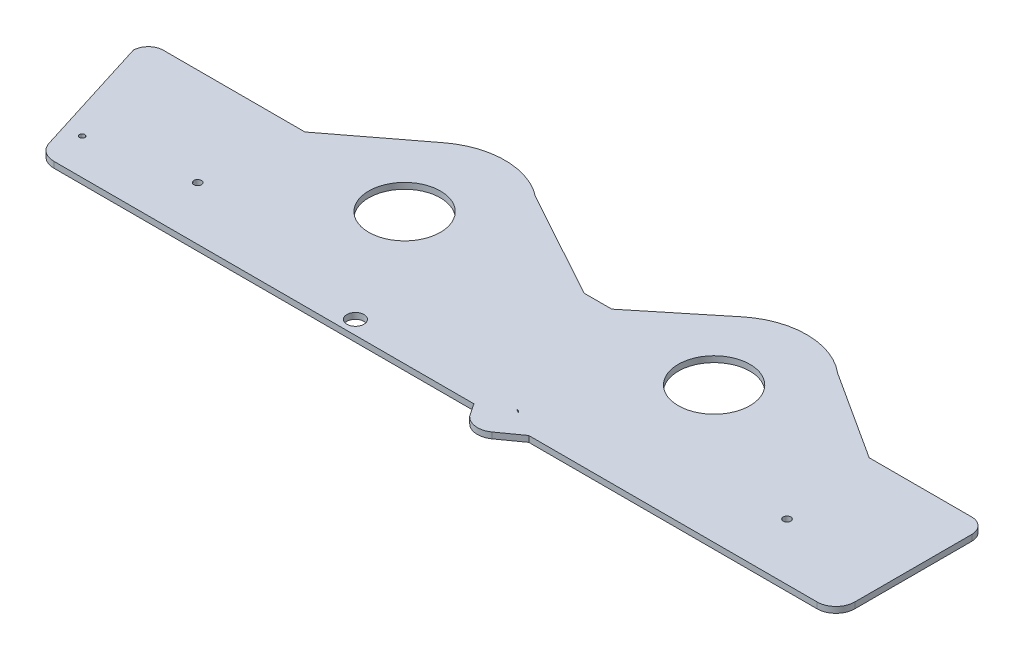
ISO-10303-21;
HEADER;
FILE_DESCRIPTION(('STEP AP214'),'2;1');
FILE_NAME('part.step','',(''),(''),'','','');
FILE_SCHEMA(('AUTOMOTIVE_DESIGN { 1 0 10303 214 1 1 1 1 }'));
ENDSEC;
DATA;
#1=APPLICATION_CONTEXT('core data for automotive mechanical design processes');
#2=APPLICATION_PROTOCOL_DEFINITION('international standard','automotive_design',2000,#1);
#3=PRODUCT_CONTEXT('',#1,'mechanical');
#4=PRODUCT('Part','Part','',(#3));
#5=PRODUCT_RELATED_PRODUCT_CATEGORY('part','',(#4));
#6=PRODUCT_DEFINITION_FORMATION('','',#4);
#7=PRODUCT_DEFINITION_CONTEXT('part definition',#1,'design');
#8=PRODUCT_DEFINITION('design','',#6,#7);
#9=PRODUCT_DEFINITION_SHAPE('','',#8);
#10=(LENGTH_UNIT() NAMED_UNIT(*) SI_UNIT(.MILLI.,.METRE.));
#11=(NAMED_UNIT(*) PLANE_ANGLE_UNIT() SI_UNIT($,.RADIAN.));
#12=(NAMED_UNIT(*) SI_UNIT($,.STERADIAN.) SOLID_ANGLE_UNIT());
#13=UNCERTAINTY_MEASURE_WITH_UNIT(LENGTH_MEASURE(1.E-05),#10,'distance_accuracy_value','');
#14=(GEOMETRIC_REPRESENTATION_CONTEXT(3) GLOBAL_UNCERTAINTY_ASSIGNED_CONTEXT((#13)) GLOBAL_UNIT_ASSIGNED_CONTEXT((#10,
#11,#12)) REPRESENTATION_CONTEXT('',''));
#15=CARTESIAN_POINT('',(0.,0.,0.));
#16=DIRECTION('',(0.,0.,1.));
#17=DIRECTION('',(1.,0.,0.));
#18=AXIS2_PLACEMENT_3D('',#15,#16,#17);
#19=CARTESIAN_POINT('',(264.5,0.,-70.));
#20=DIRECTION('',(0.,1.,0.));
#21=DIRECTION('',(0.,0.,1.));
#22=AXIS2_PLACEMENT_3D('',#19,#20,#21);
#23=CYLINDRICAL_SURFACE('',#22,10.);
#24=DIRECTION('',(0.,1.,0.));
#25=VECTOR('',#24,1.);
#26=CARTESIAN_POINT('',(270.323640372309,0.,-61.8707188009016));
#27=LINE('',#26,#25);
#28=CARTESIAN_POINT('',(270.323640372309,0.,-61.8707188009016));
#29=VERTEX_POINT('',#28);
#30=CARTESIAN_POINT('',(270.323640372309,3.175,-61.8707188009016));
#31=VERTEX_POINT('',#30);
#32=EDGE_CURVE('E215',#29,#31,#27,.T.);
#33=ORIENTED_EDGE('',*,*,#32,.T.);
#34=CARTESIAN_POINT('',(264.5,3.175,-70.));
#35=DIRECTION('',(0.,1.,0.));
#36=DIRECTION('',(0.,0.,1.));
#37=AXIS2_PLACEMENT_3D('',#34,#35,#36);
#38=CIRCLE('',#37,10.);
#39=CARTESIAN_POINT('',(257.164027826321,3.175,-63.204154779058));
#40=VERTEX_POINT('',#39);
#41=EDGE_CURVE('E58',#31,#40,#38,.F.);
#42=ORIENTED_EDGE('',*,*,#41,.T.);
#43=DIRECTION('',(0.,1.,0.));
#44=VECTOR('',#43,1.);
#45=CARTESIAN_POINT('',(257.164027826321,0.,-63.204154779058));
#46=LINE('',#45,#44);
#47=CARTESIAN_POINT('',(257.164027826321,0.,-63.204154779058));
#48=VERTEX_POINT('',#47);
#49=EDGE_CURVE('E230',#48,#40,#46,.T.);
#50=ORIENTED_EDGE('',*,*,#49,.F.);
#51=CARTESIAN_POINT('',(264.5,0.,-70.));
#52=DIRECTION('',(0.,1.,0.));
#53=DIRECTION('',(0.,0.,1.));
#54=AXIS2_PLACEMENT_3D('',#51,#52,#53);
#55=CIRCLE('',#54,10.);
#56=EDGE_CURVE('E564',#48,#29,#55,.T.);
#57=ORIENTED_EDGE('',*,*,#56,.T.);
#58=EDGE_LOOP('',(#33,#42,#50,#57));
#59=FACE_BOUND('',#58,.T.);
#60=ADVANCED_FACE('F43',(#59),#23,.T.);
#61=CARTESIAN_POINT('',(206.258119686764,0.,-138.832894737649));
#62=DIRECTION('',(-0.82957784665794,0.,0.558391078308362));
#63=DIRECTION('',(0.558391078308362,0.,0.82957784665794));
#64=AXIS2_PLACEMENT_3D('',#61,#62,#63);
#65=PLANE('',#64);
#66=ORIENTED_EDGE('',*,*,#49,.T.);
#67=DIRECTION('',(-0.558391078308362,0.,-0.82957784665794));
#68=VECTOR('',#67,1.);
#69=CARTESIAN_POINT('',(206.258119686764,3.175,-138.832894737649));
#70=LINE('',#69,#68);
#71=CARTESIAN_POINT('',(252.589726142366,3.175,-70.));
#72=VERTEX_POINT('',#71);
#73=EDGE_CURVE('E473',#40,#72,#70,.T.);
#74=ORIENTED_EDGE('',*,*,#73,.T.);
#75=DIRECTION('',(0.,1.,0.));
#76=VECTOR('',#75,1.);
#77=CARTESIAN_POINT('',(252.589726142366,0.,-70.));
#78=LINE('',#77,#76);
#79=CARTESIAN_POINT('',(252.589726142366,0.,-70.));
#80=VERTEX_POINT('',#79);
#81=EDGE_CURVE('E546',#80,#72,#78,.T.);
#82=ORIENTED_EDGE('',*,*,#81,.F.);
#83=DIRECTION('',(0.558391078308362,0.,0.82957784665794));
#84=VECTOR('',#83,1.);
#85=CARTESIAN_POINT('',(206.258119686764,0.,-138.832894737649));
#86=LINE('',#85,#84);
#87=EDGE_CURVE('E221',#80,#48,#86,.T.);
#88=ORIENTED_EDGE('',*,*,#87,.T.);
#89=EDGE_LOOP('',(#66,#74,#82,#88));
#90=FACE_BOUND('',#89,.T.);
#91=ADVANCED_FACE('F451',(#90),#65,.T.);
#92=CARTESIAN_POINT('',(101.776463936064,0.,-174.764335414678));
#93=DIRECTION('',(-0.503245940608634,0.,0.864143230755718));
#94=DIRECTION('',(0.864143230755718,0.,0.503245940608634));
#95=AXIS2_PLACEMENT_3D('',#92,#93,#94);
#96=PLANE('',#95);
#97=DIRECTION('',(-0.864143230755718,0.,-0.503245940608634));
#98=VECTOR('',#97,1.);
#99=CARTESIAN_POINT('',(101.776463936064,3.175,-174.764335414678));
#100=LINE('',#99,#98);
#101=CARTESIAN_POINT('',(268.849345076715,3.175,-77.4670978418141));
#102=VERTEX_POINT('',#101);
#103=CARTESIAN_POINT('',(266.045546336288,3.175,-79.0999293958723));
#104=VERTEX_POINT('',#103);
#105=EDGE_CURVE('E468',#102,#104,#100,.T.);
#106=ORIENTED_EDGE('',*,*,#105,.F.);
#107=DIRECTION('',(0.,1.,0.));
#108=VECTOR('',#107,1.);
#109=CARTESIAN_POINT('',(268.849345076715,0.,-77.4670978418142));
#110=LINE('',#109,#108);
#111=CARTESIAN_POINT('',(268.849345076715,0.,-77.4670978418141));
#112=VERTEX_POINT('',#111);
#113=EDGE_CURVE('E214',#112,#102,#110,.T.);
#114=ORIENTED_EDGE('',*,*,#113,.F.);
#115=DIRECTION('',(0.864143230755718,0.,0.503245940608634));
#116=VECTOR('',#115,1.);
#117=CARTESIAN_POINT('',(101.776463936064,0.,-174.764335414678));
#118=LINE('',#117,#116);
#119=CARTESIAN_POINT('',(266.045546336288,0.,-79.0999293958722));
#120=VERTEX_POINT('',#119);
#121=EDGE_CURVE('E566',#120,#112,#118,.T.);
#122=ORIENTED_EDGE('',*,*,#121,.F.);
#123=DIRECTION('',(0.,1.,0.));
#124=VECTOR('',#123,1.);
#125=CARTESIAN_POINT('',(266.045546336288,0.,-79.0999293958723));
#126=LINE('',#125,#124);
#127=EDGE_CURVE('E66',#120,#104,#126,.T.);
#128=ORIENTED_EDGE('',*,*,#127,.T.);
#129=EDGE_LOOP('',(#106,#114,#122,#128));
#130=FACE_BOUND('',#129,.T.);
#131=ADVANCED_FACE('F456',(#130),#96,.F.);
#132=CARTESIAN_POINT('',(62.3888453469937,0.,87.0892491789818));
#133=DIRECTION('',(-0.582364037230876,0.,-0.812928119909844));
#134=DIRECTION('',(-0.812928119909844,0.,0.582364037230876));
#135=AXIS2_PLACEMENT_3D('',#132,#133,#134);
#136=PLANE('',#135);
#137=DIRECTION('',(0.812928119909844,0.,-0.582364037230876));
#138=VECTOR('',#137,1.);
#139=CARTESIAN_POINT('',(62.3888453469937,3.175,87.0892491789818));
#140=LINE('',#139,#138);
#141=CARTESIAN_POINT('',(281.671389990958,3.175,-70.));
#142=VERTEX_POINT('',#141);
#143=EDGE_CURVE('E11',#31,#142,#140,.T.);
#144=ORIENTED_EDGE('',*,*,#143,.F.);
#145=ORIENTED_EDGE('',*,*,#32,.F.);
#146=DIRECTION('',(-0.812928119909844,0.,0.582364037230877));
#147=VECTOR('',#146,1.);
#148=CARTESIAN_POINT('',(62.3888453469937,0.,87.0892491789818));
#149=LINE('',#148,#147);
#150=CARTESIAN_POINT('',(281.671389990958,0.,-70.));
#151=VERTEX_POINT('',#150);
#152=EDGE_CURVE('E212',#151,#29,#149,.T.);
#153=ORIENTED_EDGE('',*,*,#152,.F.);
#154=DIRECTION('',(0.,1.,0.));
#155=VECTOR('',#154,1.);
#156=CARTESIAN_POINT('',(281.671389990958,0.,-70.));
#157=LINE('',#156,#155);
#158=EDGE_CURVE('E203',#151,#142,#157,.T.);
#159=ORIENTED_EDGE('',*,*,#158,.T.);
#160=EDGE_LOOP('',(#144,#145,#153,#159));
#161=FACE_BOUND('',#160,.T.);
#162=ADVANCED_FACE('F211',(#161),#136,.F.);
#163=CARTESIAN_POINT('',(265.281257273604,3.175,-74.5638669813256));
#164=DIRECTION('',(0.,-1.,0.));
#165=DIRECTION('',(0.,0.,-1.));
#166=AXIS2_PLACEMENT_3D('',#163,#164,#165);
#167=CYLINDRICAL_SURFACE('',#166,4.60000000000001);
#168=CARTESIAN_POINT('',(265.281257273604,3.175,-74.5638669813256));
#169=DIRECTION('',(0.,1.,0.));
#170=DIRECTION('',(0.,0.,1.));
#171=AXIS2_PLACEMENT_3D('',#168,#169,#170);
#172=CIRCLE('',#171,4.60000000000001);
#173=EDGE_CURVE('E341',#102,#104,#172,.T.);
#174=ORIENTED_EDGE('',*,*,#173,.T.);
#175=ORIENTED_EDGE('',*,*,#127,.F.);
#176=CARTESIAN_POINT('',(265.281257273604,0.,-74.5638669813256));
#177=DIRECTION('',(0.,1.,0.));
#178=DIRECTION('',(0.,0.,1.));
#179=AXIS2_PLACEMENT_3D('',#176,#177,#178);
#180=CIRCLE('',#179,4.60000000000001);
#181=EDGE_CURVE('E309',#112,#120,#180,.T.);
#182=ORIENTED_EDGE('',*,*,#181,.F.);
#183=ORIENTED_EDGE('',*,*,#113,.T.);
#184=EDGE_LOOP('',(#174,#175,#182,#183));
#185=FACE_BOUND('',#184,.T.);
#186=ADVANCED_FACE('F462',(#185),#167,.F.);
#187=CARTESIAN_POINT('',(0.,0.,-70.));
#188=DIRECTION('',(0.,0.,1.));
#189=DIRECTION('',(1.,0.,0.));
#190=AXIS2_PLACEMENT_3D('',#187,#188,#189);
#191=PLANE('',#190);
#192=DIRECTION('',(1.,0.,0.));
#193=VECTOR('',#192,1.);
#194=CARTESIAN_POINT('',(0.,3.175,-70.));
#195=LINE('',#194,#193);
#196=CARTESIAN_POINT('',(434.5,3.175,-70.));
#197=VERTEX_POINT('',#196);
#198=EDGE_CURVE('E193',#142,#197,#195,.T.);
#199=ORIENTED_EDGE('',*,*,#198,.F.);
#200=ORIENTED_EDGE('',*,*,#158,.F.);
#201=DIRECTION('',(1.,0.,0.));
#202=VECTOR('',#201,1.);
#203=CARTESIAN_POINT('',(0.,0.,-70.));
#204=LINE('',#203,#202);
#205=CARTESIAN_POINT('',(434.5,0.,-70.));
#206=VERTEX_POINT('',#205);
#207=EDGE_CURVE('E397',#151,#206,#204,.T.);
#208=ORIENTED_EDGE('',*,*,#207,.T.);
#209=DIRECTION('',(0.,1.,0.));
#210=VECTOR('',#209,1.);
#211=CARTESIAN_POINT('',(434.5,3.175,-70.));
#212=LINE('',#211,#210);
#213=EDGE_CURVE('E206',#206,#197,#212,.T.);
#214=ORIENTED_EDGE('',*,*,#213,.T.);
#215=EDGE_LOOP('',(#199,#200,#208,#214));
#216=FACE_BOUND('',#215,.T.);
#217=ADVANCED_FACE('F202',(#216),#191,.T.);
#218=CARTESIAN_POINT('',(0.,3.175,-150.));
#219=DIRECTION('',(0.,0.,-1.));
#220=DIRECTION('',(-1.,0.,0.));
#221=AXIS2_PLACEMENT_3D('',#218,#219,#220);
#222=PLANE('',#221);
#223=DIRECTION('',(1.,0.,0.));
#224=VECTOR('',#223,1.);
#225=CARTESIAN_POINT('',(0.,0.,-150.));
#226=LINE('',#225,#224);
#227=CARTESIAN_POINT('',(382.106475607173,0.,-150.));
#228=VERTEX_POINT('',#227);
#229=CARTESIAN_POINT('',(436.5,0.,-150.));
#230=VERTEX_POINT('',#229);
#231=EDGE_CURVE('E350',#228,#230,#226,.T.);
#232=ORIENTED_EDGE('',*,*,#231,.F.);
#233=DIRECTION('',(0.,-1.,0.));
#234=VECTOR('',#233,1.);
#235=CARTESIAN_POINT('',(382.106475607173,3.175,-150.));
#236=LINE('',#235,#234);
#237=CARTESIAN_POINT('',(382.106475607173,3.175,-150.));
#238=VERTEX_POINT('',#237);
#239=EDGE_CURVE('E240',#238,#228,#236,.T.);
#240=ORIENTED_EDGE('',*,*,#239,.F.);
#241=DIRECTION('',(1.,0.,0.));
#242=VECTOR('',#241,1.);
#243=CARTESIAN_POINT('',(0.,3.175,-150.));
#244=LINE('',#243,#242);
#245=CARTESIAN_POINT('',(436.5,3.175,-150.));
#246=VERTEX_POINT('',#245);
#247=EDGE_CURVE('E310',#238,#246,#244,.T.);
#248=ORIENTED_EDGE('',*,*,#247,.T.);
#249=DIRECTION('',(0.,-1.,0.));
#250=VECTOR('',#249,1.);
#251=CARTESIAN_POINT('',(436.5,3.175,-150.));
#252=LINE('',#251,#250);
#253=EDGE_CURVE('E344',#246,#230,#252,.T.);
#254=ORIENTED_EDGE('',*,*,#253,.T.);
#255=EDGE_LOOP('',(#232,#240,#248,#254));
#256=FACE_BOUND('',#255,.T.);
#257=ADVANCED_FACE('F514',(#256),#222,.T.);
#258=CARTESIAN_POINT('',(309.,3.175,-150.));
#259=DIRECTION('',(0.,-1.,0.));
#260=DIRECTION('',(0.,0.,-1.));
#261=AXIS2_PLACEMENT_3D('',#258,#259,#260);
#262=CYLINDRICAL_SURFACE('',#261,40.);
#263=DIRECTION('',(0.,-1.,0.));
#264=VECTOR('',#263,1.);
#265=CARTESIAN_POINT('',(283.734164599155,3.175,-181.010281544955));
#266=LINE('',#265,#264);
#267=CARTESIAN_POINT('',(283.734164599155,3.175,-181.010281544955));
#268=VERTEX_POINT('',#267);
#269=CARTESIAN_POINT('',(283.734164599155,0.,-181.010281544955));
#270=VERTEX_POINT('',#269);
#271=EDGE_CURVE('E264',#268,#270,#266,.T.);
#272=ORIENTED_EDGE('',*,*,#271,.F.);
#273=CARTESIAN_POINT('',(309.,3.175,-150.));
#274=DIRECTION('',(0.,1.,0.));
#275=DIRECTION('',(0.,0.,1.));
#276=AXIS2_PLACEMENT_3D('',#273,#274,#275);
#277=CIRCLE('',#276,40.);
#278=CARTESIAN_POINT('',(334.871034878903,3.175,-180.507204957101));
#279=VERTEX_POINT('',#278);
#280=EDGE_CURVE('E249',#279,#268,#277,.T.);
#281=ORIENTED_EDGE('',*,*,#280,.F.);
#282=DIRECTION('',(0.,-1.,0.));
#283=VECTOR('',#282,1.);
#284=CARTESIAN_POINT('',(334.871034878903,3.175,-180.507204957101));
#285=LINE('',#284,#283);
#286=CARTESIAN_POINT('',(334.871034878903,0.,-180.507204957101));
#287=VERTEX_POINT('',#286);
#288=EDGE_CURVE('E52',#287,#279,#285,.F.);
#289=ORIENTED_EDGE('',*,*,#288,.F.);
#290=CARTESIAN_POINT('',(309.,0.,-150.));
#291=DIRECTION('',(0.,1.,0.));
#292=DIRECTION('',(0.,0.,1.));
#293=AXIS2_PLACEMENT_3D('',#290,#291,#292);
#294=CIRCLE('',#293,40.);
#295=EDGE_CURVE('E248',#287,#270,#294,.T.);
#296=ORIENTED_EDGE('',*,*,#295,.T.);
#297=EDGE_LOOP('',(#272,#281,#289,#296));
#298=FACE_BOUND('',#297,.T.);
#299=ADVANCED_FACE('F512',(#298),#262,.T.);
#300=CARTESIAN_POINT('',(231.01461959859,3.175,-150.));
#301=VERTEX_POINT('',#300);
#302=CARTESIAN_POINT('',(245.673378314399,3.175,-150.));
#303=VERTEX_POINT('',#302);
#304=EDGE_CURVE('E308',#301,#303,#244,.T.);
#305=ORIENTED_EDGE('',*,*,#304,.T.);
#306=DIRECTION('',(0.,-1.,0.));
#307=VECTOR('',#306,1.);
#308=CARTESIAN_POINT('',(245.673378314399,3.175,-150.));
#309=LINE('',#308,#307);
#310=CARTESIAN_POINT('',(245.673378314399,0.,-150.));
#311=VERTEX_POINT('',#310);
#312=EDGE_CURVE('E256',#303,#311,#309,.T.);
#313=ORIENTED_EDGE('',*,*,#312,.T.);
#314=CARTESIAN_POINT('',(231.01461959859,0.,-150.));
#315=VERTEX_POINT('',#314);
#316=EDGE_CURVE('E349',#315,#311,#226,.T.);
#317=ORIENTED_EDGE('',*,*,#316,.F.);
#318=DIRECTION('',(0.,1.,0.));
#319=VECTOR('',#318,1.);
#320=CARTESIAN_POINT('',(231.01461959859,3.175,-150.));
#321=LINE('',#320,#319);
#322=EDGE_CURVE('E292',#315,#301,#321,.T.);
#323=ORIENTED_EDGE('',*,*,#322,.T.);
#324=EDGE_LOOP('',(#305,#313,#317,#323));
#325=FACE_BOUND('',#324,.T.);
#326=ADVANCED_FACE('F508',(#325),#222,.T.);
#327=CARTESIAN_POINT('',(8.,3.175,-150.));
#328=VERTEX_POINT('',#327);
#329=CARTESIAN_POINT('',(83.029725003325,3.175,-150.));
#330=VERTEX_POINT('',#329);
#331=EDGE_CURVE('E315',#328,#330,#244,.T.);
#332=ORIENTED_EDGE('',*,*,#331,.T.);
#333=DIRECTION('',(0.,-1.,0.));
#334=VECTOR('',#333,1.);
#335=CARTESIAN_POINT('',(83.0297250033249,3.175,-150.));
#336=LINE('',#335,#334);
#337=CARTESIAN_POINT('',(83.029725003325,0.,-150.));
#338=VERTEX_POINT('',#337);
#339=EDGE_CURVE('E295',#330,#338,#336,.T.);
#340=ORIENTED_EDGE('',*,*,#339,.T.);
#341=CARTESIAN_POINT('',(8.,0.,-150.));
#342=VERTEX_POINT('',#341);
#343=EDGE_CURVE('E355',#342,#338,#226,.T.);
#344=ORIENTED_EDGE('',*,*,#343,.F.);
#345=DIRECTION('',(0.,-1.,0.));
#346=VECTOR('',#345,1.);
#347=CARTESIAN_POINT('',(8.,3.175,-150.));
#348=LINE('',#347,#346);
#349=EDGE_CURVE('E394',#328,#342,#348,.T.);
#350=ORIENTED_EDGE('',*,*,#349,.F.);
#351=EDGE_LOOP('',(#332,#340,#344,#350));
#352=FACE_BOUND('',#351,.T.);
#353=ADVANCED_FACE('F511',(#352),#222,.T.);
#354=CARTESIAN_POINT('',(149.,3.175,-150.040398610273));
#355=DIRECTION('',(0.,-1.,0.));
#356=DIRECTION('',(0.,0.,-1.));
#357=AXIS2_PLACEMENT_3D('',#354,#355,#356);
#358=CYLINDRICAL_SURFACE('',#357,40.);
#359=DIRECTION('',(0.,-1.,0.));
#360=VECTOR('',#359,1.);
#361=CARTESIAN_POINT('',(124.164543782823,3.175,-181.39642059146));
#362=LINE('',#361,#360);
#363=CARTESIAN_POINT('',(124.164543782823,3.175,-181.39642059146));
#364=VERTEX_POINT('',#363);
#365=CARTESIAN_POINT('',(124.164543782823,0.,-181.39642059146));
#366=VERTEX_POINT('',#365);
#367=EDGE_CURVE('E288',#364,#366,#362,.T.);
#368=ORIENTED_EDGE('',*,*,#367,.F.);
#369=CARTESIAN_POINT('',(149.,3.175,-150.040398610273));
#370=DIRECTION('',(0.,1.,0.));
#371=DIRECTION('',(0.,0.,1.));
#372=AXIS2_PLACEMENT_3D('',#369,#370,#371);
#373=CIRCLE('',#372,40.);
#374=CARTESIAN_POINT('',(173.835456217177,3.175,-181.39642059146));
#375=VERTEX_POINT('',#374);
#376=EDGE_CURVE('E209',#375,#364,#373,.T.);
#377=ORIENTED_EDGE('',*,*,#376,.F.);
#378=DIRECTION('',(0.,-1.,0.));
#379=VECTOR('',#378,1.);
#380=CARTESIAN_POINT('',(173.835456217177,3.175,-181.39642059146));
#381=LINE('',#380,#379);
#382=CARTESIAN_POINT('',(173.835456217177,0.,-181.39642059146));
#383=VERTEX_POINT('',#382);
#384=EDGE_CURVE('E278',#375,#383,#381,.T.);
#385=ORIENTED_EDGE('',*,*,#384,.T.);
#386=CARTESIAN_POINT('',(149.,0.,-150.040398610273));
#387=DIRECTION('',(0.,1.,0.));
#388=DIRECTION('',(0.,0.,1.));
#389=AXIS2_PLACEMENT_3D('',#386,#387,#388);
#390=CIRCLE('',#389,40.);
#391=EDGE_CURVE('E298',#383,#366,#390,.T.);
#392=ORIENTED_EDGE('',*,*,#391,.T.);
#393=EDGE_LOOP('',(#368,#377,#385,#392));
#394=FACE_BOUND('',#393,.T.);
#395=ADVANCED_FACE('F520',(#394),#358,.T.);
#396=CARTESIAN_POINT('',(40.5261663286004,3.175,-12.7022312373225));
#397=DIRECTION('',(0.954226213925607,0.,-0.29908582824534));
#398=DIRECTION('',(-0.29908582824534,0.,-0.954226213925608));
#399=AXIS2_PLACEMENT_3D('',#396,#397,#398);
#400=PLANE('',#399);
#401=DIRECTION('',(0.29908582824534,0.,0.954226213925608));
#402=VECTOR('',#401,1.);
#403=CARTESIAN_POINT('',(40.5261663286004,0.,-12.7022312373225));
#404=LINE('',#403,#402);
#405=CARTESIAN_POINT('',(0.,0.,-142.));
#406=VERTEX_POINT('',#405);
#407=CARTESIAN_POINT('',(20.3702690139033,0.,-77.0091417175466));
#408=VERTEX_POINT('',#407);
#409=EDGE_CURVE('E360',#406,#408,#404,.T.);
#410=ORIENTED_EDGE('',*,*,#409,.T.);
#411=DIRECTION('',(0.,-1.,0.));
#412=VECTOR('',#411,1.);
#413=CARTESIAN_POINT('',(20.3702690139033,3.175,-77.0091417175466));
#414=LINE('',#413,#412);
#415=CARTESIAN_POINT('',(20.3702690139033,3.175,-77.0091417175466));
#416=VERTEX_POINT('',#415);
#417=EDGE_CURVE('E408',#408,#416,#414,.F.);
#418=ORIENTED_EDGE('',*,*,#417,.T.);
#419=DIRECTION('',(0.29908582824534,0.,0.954226213925608));
#420=VECTOR('',#419,1.);
#421=CARTESIAN_POINT('',(40.5261663286004,3.175,-12.7022312373225));
#422=LINE('',#421,#420);
#423=CARTESIAN_POINT('',(0.,3.175,-142.));
#424=VERTEX_POINT('',#423);
#425=EDGE_CURVE('E320',#424,#416,#422,.T.);
#426=ORIENTED_EDGE('',*,*,#425,.F.);
#427=DIRECTION('',(0.,-1.,0.));
#428=VECTOR('',#427,1.);
#429=CARTESIAN_POINT('',(0.,3.175,-142.));
#430=LINE('',#429,#428);
#431=EDGE_CURVE('E390',#424,#406,#430,.T.);
#432=ORIENTED_EDGE('',*,*,#431,.T.);
#433=EDGE_LOOP('',(#410,#418,#426,#432));
#434=FACE_BOUND('',#433,.T.);
#435=ADVANCED_FACE('F486',(#434),#400,.F.);
#436=CARTESIAN_POINT('',(444.5,3.175,0.));
#437=DIRECTION('',(-1.,0.,0.));
#438=DIRECTION('',(0.,0.,1.));
#439=AXIS2_PLACEMENT_3D('',#436,#437,#438);
#440=PLANE('',#439);
#441=DIRECTION('',(0.,0.,-1.));
#442=VECTOR('',#441,1.);
#443=CARTESIAN_POINT('',(444.5,3.175,0.));
#444=LINE('',#443,#442);
#445=CARTESIAN_POINT('',(444.5,3.175,-80.));
#446=VERTEX_POINT('',#445);
#447=CARTESIAN_POINT('',(444.5,3.175,-142.));
#448=VERTEX_POINT('',#447);
#449=EDGE_CURVE('E324',#446,#448,#444,.T.);
#450=ORIENTED_EDGE('',*,*,#449,.F.);
#451=DIRECTION('',(0.,1.,0.));
#452=VECTOR('',#451,1.);
#453=CARTESIAN_POINT('',(444.5,0.,-80.));
#454=LINE('',#453,#452);
#455=CARTESIAN_POINT('',(444.5,0.,-80.));
#456=VERTEX_POINT('',#455);
#457=EDGE_CURVE('E419',#446,#456,#454,.F.);
#458=ORIENTED_EDGE('',*,*,#457,.T.);
#459=DIRECTION('',(0.,0.,-1.));
#460=VECTOR('',#459,1.);
#461=CARTESIAN_POINT('',(444.5,0.,0.));
#462=LINE('',#461,#460);
#463=CARTESIAN_POINT('',(444.5,0.,-142.));
#464=VERTEX_POINT('',#463);
#465=EDGE_CURVE('E364',#456,#464,#462,.T.);
#466=ORIENTED_EDGE('',*,*,#465,.T.);
#467=DIRECTION('',(0.,-1.,0.));
#468=VECTOR('',#467,1.);
#469=CARTESIAN_POINT('',(444.5,3.175,-142.));
#470=LINE('',#469,#468);
#471=EDGE_CURVE('E386',#448,#464,#470,.T.);
#472=ORIENTED_EDGE('',*,*,#471,.F.);
#473=EDGE_LOOP('',(#450,#458,#466,#472));
#474=FACE_BOUND('',#473,.T.);
#475=ADVANCED_FACE('F477',(#474),#440,.F.);
#476=CARTESIAN_POINT('',(0.,3.175,0.));
#477=DIRECTION('',(0.,1.,0.));
#478=DIRECTION('',(0.,0.,1.));
#479=AXIS2_PLACEMENT_3D('',#476,#477,#478);
#480=PLANE('',#479);
#481=CARTESIAN_POINT('',(29.9125311531594,3.175,-70.));
#482=VERTEX_POINT('',#481);
#483=EDGE_CURVE('E208',#482,#72,#195,.T.);
#484=ORIENTED_EDGE('',*,*,#483,.T.);
#485=ORIENTED_EDGE('',*,*,#73,.F.);
#486=ORIENTED_EDGE('',*,*,#41,.F.);
#487=ORIENTED_EDGE('',*,*,#143,.T.);
#488=ORIENTED_EDGE('',*,*,#198,.T.);
#489=CARTESIAN_POINT('',(434.5,3.175,-80.));
#490=DIRECTION('',(0.,1.,0.));
#491=DIRECTION('',(0.,0.,1.));
#492=AXIS2_PLACEMENT_3D('',#489,#490,#491);
#493=CIRCLE('',#492,10.);
#494=EDGE_CURVE('E416',#197,#446,#493,.T.);
#495=ORIENTED_EDGE('',*,*,#494,.T.);
#496=ORIENTED_EDGE('',*,*,#449,.T.);
#497=CARTESIAN_POINT('',(436.5,3.175,-142.));
#498=DIRECTION('',(0.,1.,0.));
#499=DIRECTION('',(0.,0.,1.));
#500=AXIS2_PLACEMENT_3D('',#497,#498,#499);
#501=CIRCLE('',#500,7.99999999999999);
#502=EDGE_CURVE('E314',#448,#246,#501,.T.);
#503=ORIENTED_EDGE('',*,*,#502,.T.);
#504=ORIENTED_EDGE('',*,*,#247,.F.);
#505=DIRECTION('',(-0.840031412026268,0.,-0.542537765329893));
#506=VECTOR('',#505,1.);
#507=CARTESIAN_POINT('',(326.166341834622,3.175,-186.129166998658));
#508=LINE('',#507,#506);
#509=EDGE_CURVE('E236',#238,#279,#508,.T.);
#510=ORIENTED_EDGE('',*,*,#509,.T.);
#511=ORIENTED_EDGE('',*,*,#280,.T.);
#512=DIRECTION('',(-0.775257038623885,0.,0.631645885021129));
#513=VECTOR('',#512,1.);
#514=CARTESIAN_POINT('',(24.5647227929031,3.175,30.1497638133203));
#515=LINE('',#514,#513);
#516=EDGE_CURVE('E252',#268,#303,#515,.T.);
#517=ORIENTED_EDGE('',*,*,#516,.T.);
#518=ORIENTED_EDGE('',*,*,#304,.F.);
#519=DIRECTION('',(-0.876553077336371,0.,-0.48130520733952));
#520=VECTOR('',#519,1.);
#521=CARTESIAN_POINT('',(173.835456217177,3.175,-181.39642059146));
#522=LINE('',#521,#520);
#523=EDGE_CURVE('E273',#301,#375,#522,.T.);
#524=ORIENTED_EDGE('',*,*,#523,.T.);
#525=ORIENTED_EDGE('',*,*,#376,.T.);
#526=DIRECTION('',(-0.794913416528383,0.,0.606722885857435));
#527=VECTOR('',#526,1.);
#528=CARTESIAN_POINT('',(124.164543782823,3.175,-181.39642059146));
#529=LINE('',#528,#527);
#530=EDGE_CURVE('E269',#364,#330,#529,.T.);
#531=ORIENTED_EDGE('',*,*,#530,.T.);
#532=ORIENTED_EDGE('',*,*,#331,.F.);
#533=CARTESIAN_POINT('',(8.,3.175,-142.));
#534=DIRECTION('',(0.,1.,0.));
#535=DIRECTION('',(0.,0.,1.));
#536=AXIS2_PLACEMENT_3D('',#533,#534,#535);
#537=CIRCLE('',#536,8.);
#538=EDGE_CURVE('E316',#328,#424,#537,.T.);
#539=ORIENTED_EDGE('',*,*,#538,.T.);
#540=ORIENTED_EDGE('',*,*,#425,.T.);
#541=CARTESIAN_POINT('',(29.9125311531594,3.175,-80.));
#542=DIRECTION('',(0.,1.,0.));
#543=DIRECTION('',(0.,0.,1.));
#544=AXIS2_PLACEMENT_3D('',#541,#542,#543);
#545=CIRCLE('',#544,10.);
#546=EDGE_CURVE('E411',#416,#482,#545,.T.);
#547=ORIENTED_EDGE('',*,*,#546,.T.);
#548=EDGE_LOOP('',(#484,#485,#486,#487,#488,#495,#496,#503,#504,#510,#511,#517,#518,#524,#525,
#531,#532,#539,#540,#547));
#549=FACE_BOUND('',#548,.T.);
#550=CARTESIAN_POINT('',(307.606475607173,3.175,-142.29806447673));
#551=DIRECTION('',(0.,1.,0.));
#552=DIRECTION('',(0.,0.,1.));
#553=AXIS2_PLACEMENT_3D('',#550,#551,#552);
#554=CIRCLE('',#553,19.);
#555=CARTESIAN_POINT('',(307.606475607173,3.175,-123.29806447673));
#556=VERTEX_POINT('',#555);
#557=EDGE_CURVE('E225',#556,#556,#554,.T.);
#558=ORIENTED_EDGE('',*,*,#557,.F.);
#559=EDGE_LOOP('',(#558));
#560=FACE_BOUND('',#559,.T.);
#561=CARTESIAN_POINT('',(146.,3.175,-139.840398610273));
#562=DIRECTION('',(0.,1.,0.));
#563=DIRECTION('',(0.,0.,1.));
#564=AXIS2_PLACEMENT_3D('',#561,#562,#563);
#565=CIRCLE('',#564,19.);
#566=CARTESIAN_POINT('',(146.,3.175,-120.840398610273));
#567=VERTEX_POINT('',#566);
#568=EDGE_CURVE('E231',#567,#567,#565,.T.);
#569=ORIENTED_EDGE('',*,*,#568,.F.);
#570=EDGE_LOOP('',(#569));
#571=FACE_BOUND('',#570,.T.);
#572=CARTESIAN_POINT('',(25.8543526588255,3.175,-89.0892529737037));
#573=DIRECTION('',(0.,1.,0.));
#574=DIRECTION('',(0.,0.,1.));
#575=AXIS2_PLACEMENT_3D('',#572,#573,#574);
#576=CIRCLE('',#575,1.42941406231157);
#577=CARTESIAN_POINT('',(25.8543526588255,3.175,-87.6598389113922));
#578=VERTEX_POINT('',#577);
#579=EDGE_CURVE('E304',#578,#578,#576,.T.);
#580=ORIENTED_EDGE('',*,*,#579,.F.);
#581=EDGE_LOOP('',(#580));
#582=FACE_BOUND('',#581,.T.);
#583=CARTESIAN_POINT('',(182.429479385468,3.175,-77.355745695013));
#584=DIRECTION('',(0.,1.,0.));
#585=DIRECTION('',(0.,0.,1.));
#586=AXIS2_PLACEMENT_3D('',#583,#584,#585);
#587=CIRCLE('',#586,4.50864138025262);
#588=CARTESIAN_POINT('',(182.429479385468,3.175,-72.8471043147604));
#589=VERTEX_POINT('',#588);
#590=EDGE_CURVE('E313',#589,#589,#587,.T.);
#591=ORIENTED_EDGE('',*,*,#590,.F.);
#592=EDGE_LOOP('',(#591));
#593=FACE_BOUND('',#592,.T.);
#594=CARTESIAN_POINT('',(77.8217508144213,3.175,-98.3272193932275));
#595=DIRECTION('',(0.,1.,0.));
#596=DIRECTION('',(0.,0.,1.));
#597=AXIS2_PLACEMENT_3D('',#594,#595,#596);
#598=CIRCLE('',#597,1.99999999999995);
#599=CARTESIAN_POINT('',(77.8217508144213,3.175,-96.3272193932276));
#600=VERTEX_POINT('',#599);
#601=EDGE_CURVE('E333',#600,#600,#598,.T.);
#602=ORIENTED_EDGE('',*,*,#601,.F.);
#603=EDGE_LOOP('',(#602));
#604=FACE_BOUND('',#603,.T.);
#605=CARTESIAN_POINT('',(388.475756445113,3.175,-100.077126904902));
#606=DIRECTION('',(0.,1.,0.));
#607=DIRECTION('',(0.,0.,1.));
#608=AXIS2_PLACEMENT_3D('',#605,#606,#607);
#609=CIRCLE('',#608,1.99999999999994);
#610=CARTESIAN_POINT('',(388.475756445113,3.175,-98.0771269049019));
#611=VERTEX_POINT('',#610);
#612=EDGE_CURVE('E337',#611,#611,#609,.T.);
#613=ORIENTED_EDGE('',*,*,#612,.F.);
#614=EDGE_LOOP('',(#613));
#615=FACE_BOUND('',#614,.T.);
#616=ORIENTED_EDGE('',*,*,#105,.T.);
#617=ORIENTED_EDGE('',*,*,#173,.F.);
#618=EDGE_LOOP('',(#616,#617));
#619=FACE_BOUND('',#618,.T.);
#620=ADVANCED_FACE('F191',(#549,#560,#571,#582,#593,#604,#615,#619),#480,.T.);
#621=CARTESIAN_POINT('',(0.,0.,0.));
#622=DIRECTION('',(0.,1.,0.));
#623=DIRECTION('',(0.,0.,1.));
#624=AXIS2_PLACEMENT_3D('',#621,#622,#623);
#625=PLANE('',#624);
#626=ORIENTED_EDGE('',*,*,#181,.T.);
#627=ORIENTED_EDGE('',*,*,#121,.T.);
#628=EDGE_LOOP('',(#626,#627));
#629=FACE_BOUND('',#628,.T.);
#630=ORIENTED_EDGE('',*,*,#207,.F.);
#631=ORIENTED_EDGE('',*,*,#152,.T.);
#632=ORIENTED_EDGE('',*,*,#56,.F.);
#633=ORIENTED_EDGE('',*,*,#87,.F.);
#634=CARTESIAN_POINT('',(29.9125311531594,0.,-70.));
#635=VERTEX_POINT('',#634);
#636=EDGE_CURVE('E400',#635,#80,#204,.T.);
#637=ORIENTED_EDGE('',*,*,#636,.F.);
#638=CARTESIAN_POINT('',(29.9125311531594,0.,-80.));
#639=DIRECTION('',(0.,1.,0.));
#640=DIRECTION('',(0.,0.,1.));
#641=AXIS2_PLACEMENT_3D('',#638,#639,#640);
#642=CIRCLE('',#641,10.);
#643=EDGE_CURVE('E405',#635,#408,#642,.F.);
#644=ORIENTED_EDGE('',*,*,#643,.T.);
#645=ORIENTED_EDGE('',*,*,#409,.F.);
#646=CARTESIAN_POINT('',(8.,0.,-142.));
#647=DIRECTION('',(0.,1.,0.));
#648=DIRECTION('',(0.,0.,1.));
#649=AXIS2_PLACEMENT_3D('',#646,#647,#648);
#650=CIRCLE('',#649,8.);
#651=EDGE_CURVE('E356',#342,#406,#650,.T.);
#652=ORIENTED_EDGE('',*,*,#651,.F.);
#653=ORIENTED_EDGE('',*,*,#343,.T.);
#654=DIRECTION('',(-0.794913416528383,0.,0.606722885857435));
#655=VECTOR('',#654,1.);
#656=CARTESIAN_POINT('',(124.164543782823,0.,-181.39642059146));
#657=LINE('',#656,#655);
#658=EDGE_CURVE('E268',#366,#338,#657,.T.);
#659=ORIENTED_EDGE('',*,*,#658,.F.);
#660=ORIENTED_EDGE('',*,*,#391,.F.);
#661=DIRECTION('',(-0.876553077336371,0.,-0.48130520733952));
#662=VECTOR('',#661,1.);
#663=CARTESIAN_POINT('',(173.835456217177,0.,-181.39642059146));
#664=LINE('',#663,#662);
#665=EDGE_CURVE('E274',#315,#383,#664,.T.);
#666=ORIENTED_EDGE('',*,*,#665,.F.);
#667=ORIENTED_EDGE('',*,*,#316,.T.);
#668=DIRECTION('',(-0.775257038623885,0.,0.631645885021129));
#669=VECTOR('',#668,1.);
#670=CARTESIAN_POINT('',(24.5647227929031,0.,30.1497638133203));
#671=LINE('',#670,#669);
#672=EDGE_CURVE('E253',#270,#311,#671,.T.);
#673=ORIENTED_EDGE('',*,*,#672,.F.);
#674=ORIENTED_EDGE('',*,*,#295,.F.);
#675=DIRECTION('',(-0.840031412026268,0.,-0.542537765329893));
#676=VECTOR('',#675,1.);
#677=CARTESIAN_POINT('',(326.166341834622,0.,-186.129166998658));
#678=LINE('',#677,#676);
#679=EDGE_CURVE('E241',#228,#287,#678,.T.);
#680=ORIENTED_EDGE('',*,*,#679,.F.);
#681=ORIENTED_EDGE('',*,*,#231,.T.);
#682=CARTESIAN_POINT('',(436.5,0.,-142.));
#683=DIRECTION('',(0.,1.,0.));
#684=DIRECTION('',(0.,0.,1.));
#685=AXIS2_PLACEMENT_3D('',#682,#683,#684);
#686=CIRCLE('',#685,7.99999999999999);
#687=EDGE_CURVE('E354',#464,#230,#686,.T.);
#688=ORIENTED_EDGE('',*,*,#687,.F.);
#689=ORIENTED_EDGE('',*,*,#465,.F.);
#690=CARTESIAN_POINT('',(434.5,0.,-80.));
#691=DIRECTION('',(0.,1.,0.));
#692=DIRECTION('',(0.,0.,1.));
#693=AXIS2_PLACEMENT_3D('',#690,#691,#692);
#694=CIRCLE('',#693,10.);
#695=EDGE_CURVE('E422',#456,#206,#694,.F.);
#696=ORIENTED_EDGE('',*,*,#695,.T.);
#697=EDGE_LOOP('',(#630,#631,#632,#633,#637,#644,#645,#652,#653,#659,#660,#666,#667,#673,#674,
#680,#681,#688,#689,#696));
#698=FACE_BOUND('',#697,.T.);
#699=CARTESIAN_POINT('',(307.606475607173,0.,-142.29806447673));
#700=DIRECTION('',(0.,1.,0.));
#701=DIRECTION('',(0.,0.,1.));
#702=AXIS2_PLACEMENT_3D('',#699,#700,#701);
#703=CIRCLE('',#702,19.);
#704=CARTESIAN_POINT('',(307.606475607173,0.,-123.29806447673));
#705=VERTEX_POINT('',#704);
#706=EDGE_CURVE('E229',#705,#705,#703,.T.);
#707=ORIENTED_EDGE('',*,*,#706,.T.);
#708=EDGE_LOOP('',(#707));
#709=FACE_BOUND('',#708,.T.);
#710=CARTESIAN_POINT('',(146.,0.,-139.840398610273));
#711=DIRECTION('',(0.,1.,0.));
#712=DIRECTION('',(0.,0.,1.));
#713=AXIS2_PLACEMENT_3D('',#710,#711,#712);
#714=CIRCLE('',#713,19.);
#715=CARTESIAN_POINT('',(146.,0.,-120.840398610273));
#716=VERTEX_POINT('',#715);
#717=EDGE_CURVE('E235',#716,#716,#714,.T.);
#718=ORIENTED_EDGE('',*,*,#717,.T.);
#719=EDGE_LOOP('',(#718));
#720=FACE_BOUND('',#719,.T.);
#721=CARTESIAN_POINT('',(25.8543526588255,0.,-89.0892529737037));
#722=DIRECTION('',(0.,1.,0.));
#723=DIRECTION('',(0.,0.,1.));
#724=AXIS2_PLACEMENT_3D('',#721,#722,#723);
#725=CIRCLE('',#724,1.42941406231157);
#726=CARTESIAN_POINT('',(25.8543526588255,0.,-87.6598389113922));
#727=VERTEX_POINT('',#726);
#728=EDGE_CURVE('E345',#727,#727,#725,.T.);
#729=ORIENTED_EDGE('',*,*,#728,.T.);
#730=EDGE_LOOP('',(#729));
#731=FACE_BOUND('',#730,.T.);
#732=CARTESIAN_POINT('',(182.429479385468,0.,-77.355745695013));
#733=DIRECTION('',(0.,1.,0.));
#734=DIRECTION('',(0.,0.,1.));
#735=AXIS2_PLACEMENT_3D('',#732,#733,#734);
#736=CIRCLE('',#735,4.50864138025262);
#737=CARTESIAN_POINT('',(182.429479385468,0.,-72.8471043147604));
#738=VERTEX_POINT('',#737);
#739=EDGE_CURVE('E353',#738,#738,#736,.T.);
#740=ORIENTED_EDGE('',*,*,#739,.T.);
#741=EDGE_LOOP('',(#740));
#742=FACE_BOUND('',#741,.T.);
#743=CARTESIAN_POINT('',(77.8217508144213,0.,-98.3272193932275));
#744=DIRECTION('',(0.,1.,0.));
#745=DIRECTION('',(0.,0.,1.));
#746=AXIS2_PLACEMENT_3D('',#743,#744,#745);
#747=CIRCLE('',#746,1.99999999999995);
#748=CARTESIAN_POINT('',(77.8217508144213,0.,-96.3272193932276));
#749=VERTEX_POINT('',#748);
#750=EDGE_CURVE('E373',#749,#749,#747,.T.);
#751=ORIENTED_EDGE('',*,*,#750,.T.);
#752=EDGE_LOOP('',(#751));
#753=FACE_BOUND('',#752,.T.);
#754=CARTESIAN_POINT('',(388.475756445113,0.,-100.077126904902));
#755=DIRECTION('',(0.,1.,0.));
#756=DIRECTION('',(0.,0.,1.));
#757=AXIS2_PLACEMENT_3D('',#754,#755,#756);
#758=CIRCLE('',#757,1.99999999999994);
#759=CARTESIAN_POINT('',(388.475756445113,0.,-98.0771269049019));
#760=VERTEX_POINT('',#759);
#761=EDGE_CURVE('E377',#760,#760,#758,.T.);
#762=ORIENTED_EDGE('',*,*,#761,.T.);
#763=EDGE_LOOP('',(#762));
#764=FACE_BOUND('',#763,.T.);
#765=ADVANCED_FACE('F435',(#629,#698,#709,#720,#731,#742,#753,#764),#625,.F.);
#766=CARTESIAN_POINT('',(8.,3.175,-142.));
#767=DIRECTION('',(0.,-1.,0.));
#768=DIRECTION('',(0.,0.,-1.));
#769=AXIS2_PLACEMENT_3D('',#766,#767,#768);
#770=CYLINDRICAL_SURFACE('',#769,8.);
#771=ORIENTED_EDGE('',*,*,#651,.T.);
#772=ORIENTED_EDGE('',*,*,#431,.F.);
#773=ORIENTED_EDGE('',*,*,#538,.F.);
#774=ORIENTED_EDGE('',*,*,#349,.T.);
#775=EDGE_LOOP('',(#771,#772,#773,#774));
#776=FACE_BOUND('',#775,.T.);
#777=ADVANCED_FACE('F483',(#776),#770,.T.);
#778=CARTESIAN_POINT('',(436.5,3.175,-142.));
#779=DIRECTION('',(0.,-1.,0.));
#780=DIRECTION('',(0.,0.,-1.));
#781=AXIS2_PLACEMENT_3D('',#778,#779,#780);
#782=CYLINDRICAL_SURFACE('',#781,7.99999999999999);
#783=ORIENTED_EDGE('',*,*,#687,.T.);
#784=ORIENTED_EDGE('',*,*,#253,.F.);
#785=ORIENTED_EDGE('',*,*,#502,.F.);
#786=ORIENTED_EDGE('',*,*,#471,.T.);
#787=EDGE_LOOP('',(#783,#784,#785,#786));
#788=FACE_BOUND('',#787,.T.);
#789=ADVANCED_FACE('F498',(#788),#782,.T.);
#790=CARTESIAN_POINT('',(388.475756445113,3.175,-100.077126904902));
#791=DIRECTION('',(0.,-1.,0.));
#792=DIRECTION('',(0.,0.,-1.));
#793=AXIS2_PLACEMENT_3D('',#790,#791,#792);
#794=CYLINDRICAL_SURFACE('',#793,1.99999999999994);
#795=ORIENTED_EDGE('',*,*,#612,.T.);
#796=EDGE_LOOP('',(#795));
#797=FACE_BOUND('',#796,.T.);
#798=ORIENTED_EDGE('',*,*,#761,.F.);
#799=EDGE_LOOP('',(#798));
#800=FACE_BOUND('',#799,.T.);
#801=ADVANCED_FACE('F494',(#797,#800),#794,.F.);
#802=CARTESIAN_POINT('',(77.8217508144213,3.175,-98.3272193932275));
#803=DIRECTION('',(0.,-1.,0.));
#804=DIRECTION('',(0.,0.,-1.));
#805=AXIS2_PLACEMENT_3D('',#802,#803,#804);
#806=CYLINDRICAL_SURFACE('',#805,1.99999999999995);
#807=ORIENTED_EDGE('',*,*,#601,.T.);
#808=EDGE_LOOP('',(#807));
#809=FACE_BOUND('',#808,.T.);
#810=ORIENTED_EDGE('',*,*,#750,.F.);
#811=EDGE_LOOP('',(#810));
#812=FACE_BOUND('',#811,.T.);
#813=ADVANCED_FACE('F497',(#809,#812),#806,.F.);
#814=CARTESIAN_POINT('',(182.429479385468,3.175,-77.355745695013));
#815=DIRECTION('',(0.,-1.,0.));
#816=DIRECTION('',(0.,0.,-1.));
#817=AXIS2_PLACEMENT_3D('',#814,#815,#816);
#818=CYLINDRICAL_SURFACE('',#817,4.50864138025262);
#819=ORIENTED_EDGE('',*,*,#590,.T.);
#820=EDGE_LOOP('',(#819));
#821=FACE_BOUND('',#820,.T.);
#822=ORIENTED_EDGE('',*,*,#739,.F.);
#823=EDGE_LOOP('',(#822));
#824=FACE_BOUND('',#823,.T.);
#825=ADVANCED_FACE('F502',(#821,#824),#818,.F.);
#826=CARTESIAN_POINT('',(25.8543526588255,3.175,-89.0892529737037));
#827=DIRECTION('',(0.,-1.,0.));
#828=DIRECTION('',(0.,0.,-1.));
#829=AXIS2_PLACEMENT_3D('',#826,#827,#828);
#830=CYLINDRICAL_SURFACE('',#829,1.42941406231157);
#831=ORIENTED_EDGE('',*,*,#579,.T.);
#832=EDGE_LOOP('',(#831));
#833=FACE_BOUND('',#832,.T.);
#834=ORIENTED_EDGE('',*,*,#728,.F.);
#835=EDGE_LOOP('',(#834));
#836=FACE_BOUND('',#835,.T.);
#837=ADVANCED_FACE('F506',(#833,#836),#830,.F.);
#838=ORIENTED_EDGE('',*,*,#81,.T.);
#839=ORIENTED_EDGE('',*,*,#483,.F.);
#840=DIRECTION('',(0.,-1.,0.));
#841=VECTOR('',#840,1.);
#842=CARTESIAN_POINT('',(29.9125311531594,0.,-70.));
#843=LINE('',#842,#841);
#844=EDGE_CURVE('E401',#482,#635,#843,.T.);
#845=ORIENTED_EDGE('',*,*,#844,.T.);
#846=ORIENTED_EDGE('',*,*,#636,.T.);
#847=EDGE_LOOP('',(#838,#839,#845,#846));
#848=FACE_BOUND('',#847,.T.);
#849=ADVANCED_FACE('F526',(#848),#191,.T.);
#850=CARTESIAN_POINT('',(29.9125311531594,0.,-80.));
#851=DIRECTION('',(0.,1.,0.));
#852=DIRECTION('',(0.,0.,1.));
#853=AXIS2_PLACEMENT_3D('',#850,#851,#852);
#854=CYLINDRICAL_SURFACE('',#853,10.);
#855=ORIENTED_EDGE('',*,*,#546,.F.);
#856=ORIENTED_EDGE('',*,*,#417,.F.);
#857=ORIENTED_EDGE('',*,*,#643,.F.);
#858=ORIENTED_EDGE('',*,*,#844,.F.);
#859=EDGE_LOOP('',(#855,#856,#857,#858));
#860=FACE_BOUND('',#859,.T.);
#861=ADVANCED_FACE('F528',(#860),#854,.T.);
#862=CARTESIAN_POINT('',(434.5,0.,-80.));
#863=DIRECTION('',(0.,-1.,0.));
#864=DIRECTION('',(0.,0.,-1.));
#865=AXIS2_PLACEMENT_3D('',#862,#863,#864);
#866=CYLINDRICAL_SURFACE('',#865,10.);
#867=ORIENTED_EDGE('',*,*,#695,.F.);
#868=ORIENTED_EDGE('',*,*,#457,.F.);
#869=ORIENTED_EDGE('',*,*,#494,.F.);
#870=ORIENTED_EDGE('',*,*,#213,.F.);
#871=EDGE_LOOP('',(#867,#868,#869,#870));
#872=FACE_BOUND('',#871,.T.);
#873=ADVANCED_FACE('F45',(#872),#866,.T.);
#874=CARTESIAN_POINT('',(124.164543782823,3.175,-181.39642059146));
#875=DIRECTION('',(0.606722885857435,0.,0.794913416528383));
#876=DIRECTION('',(0.794913416528383,0.,-0.606722885857435));
#877=AXIS2_PLACEMENT_3D('',#874,#875,#876);
#878=PLANE('',#877);
#879=ORIENTED_EDGE('',*,*,#339,.F.);
#880=ORIENTED_EDGE('',*,*,#530,.F.);
#881=ORIENTED_EDGE('',*,*,#367,.T.);
#882=ORIENTED_EDGE('',*,*,#658,.T.);
#883=EDGE_LOOP('',(#879,#880,#881,#882));
#884=FACE_BOUND('',#883,.T.);
#885=ADVANCED_FACE('F535',(#884),#878,.F.);
#886=CARTESIAN_POINT('',(173.835456217177,3.175,-181.39642059146));
#887=DIRECTION('',(-0.48130520733952,0.,0.876553077336371));
#888=DIRECTION('',(0.876553077336371,0.,0.48130520733952));
#889=AXIS2_PLACEMENT_3D('',#886,#887,#888);
#890=PLANE('',#889);
#891=ORIENTED_EDGE('',*,*,#322,.F.);
#892=ORIENTED_EDGE('',*,*,#665,.T.);
#893=ORIENTED_EDGE('',*,*,#384,.F.);
#894=ORIENTED_EDGE('',*,*,#523,.F.);
#895=EDGE_LOOP('',(#891,#892,#893,#894));
#896=FACE_BOUND('',#895,.T.);
#897=ADVANCED_FACE('F607',(#896),#890,.F.);
#898=CARTESIAN_POINT('',(24.5647227929031,3.175,30.1497638133203));
#899=DIRECTION('',(0.631645885021129,0.,0.775257038623884));
#900=DIRECTION('',(0.775257038623885,0.,-0.631645885021129));
#901=AXIS2_PLACEMENT_3D('',#898,#899,#900);
#902=PLANE('',#901);
#903=ORIENTED_EDGE('',*,*,#672,.T.);
#904=ORIENTED_EDGE('',*,*,#312,.F.);
#905=ORIENTED_EDGE('',*,*,#516,.F.);
#906=ORIENTED_EDGE('',*,*,#271,.T.);
#907=EDGE_LOOP('',(#903,#904,#905,#906));
#908=FACE_BOUND('',#907,.T.);
#909=ADVANCED_FACE('F602',(#908),#902,.F.);
#910=CARTESIAN_POINT('',(326.166341834622,3.175,-186.129166998658));
#911=DIRECTION('',(-0.542537765329893,0.,0.840031412026268));
#912=DIRECTION('',(0.840031412026268,0.,0.542537765329893));
#913=AXIS2_PLACEMENT_3D('',#910,#911,#912);
#914=PLANE('',#913);
#915=ORIENTED_EDGE('',*,*,#679,.T.);
#916=ORIENTED_EDGE('',*,*,#288,.T.);
#917=ORIENTED_EDGE('',*,*,#509,.F.);
#918=ORIENTED_EDGE('',*,*,#239,.T.);
#919=EDGE_LOOP('',(#915,#916,#917,#918));
#920=FACE_BOUND('',#919,.T.);
#921=ADVANCED_FACE('F446',(#920),#914,.F.);
#922=CARTESIAN_POINT('',(146.,-6.825,-139.840398610273));
#923=DIRECTION('',(0.,1.,0.));
#924=DIRECTION('',(0.,0.,1.));
#925=AXIS2_PLACEMENT_3D('',#922,#923,#924);
#926=CYLINDRICAL_SURFACE('',#925,19.);
#927=ORIENTED_EDGE('',*,*,#568,.T.);
#928=EDGE_LOOP('',(#927));
#929=FACE_BOUND('',#928,.T.);
#930=ORIENTED_EDGE('',*,*,#717,.F.);
#931=EDGE_LOOP('',(#930));
#932=FACE_BOUND('',#931,.T.);
#933=ADVANCED_FACE('F440',(#929,#932),#926,.F.);
#934=CARTESIAN_POINT('',(307.606475607173,-6.825,-142.29806447673));
#935=DIRECTION('',(0.,1.,0.));
#936=DIRECTION('',(0.,0.,1.));
#937=AXIS2_PLACEMENT_3D('',#934,#935,#936);
#938=CYLINDRICAL_SURFACE('',#937,19.);
#939=ORIENTED_EDGE('',*,*,#557,.T.);
#940=EDGE_LOOP('',(#939));
#941=FACE_BOUND('',#940,.T.);
#942=ORIENTED_EDGE('',*,*,#706,.F.);
#943=EDGE_LOOP('',(#942));
#944=FACE_BOUND('',#943,.T.);
#945=ADVANCED_FACE('F438',(#941,#944),#938,.F.);
#946=CLOSED_SHELL('',(#60,#91,#131,#162,#186,#217,#257,#299,#326,#353,#395,#435,#475,#620,#765,
#777,#789,#801,#813,#825,#837,#849,#861,#873,#885,#897,#909,#921,#933,#945));
#947=MANIFOLD_SOLID_BREP('B2',#946);
#948=ADVANCED_BREP_SHAPE_REPRESENTATION('',(#18,#947),#14);
#949=SHAPE_DEFINITION_REPRESENTATION(#9,#948);
ENDSEC;
END-ISO-10303-21;
